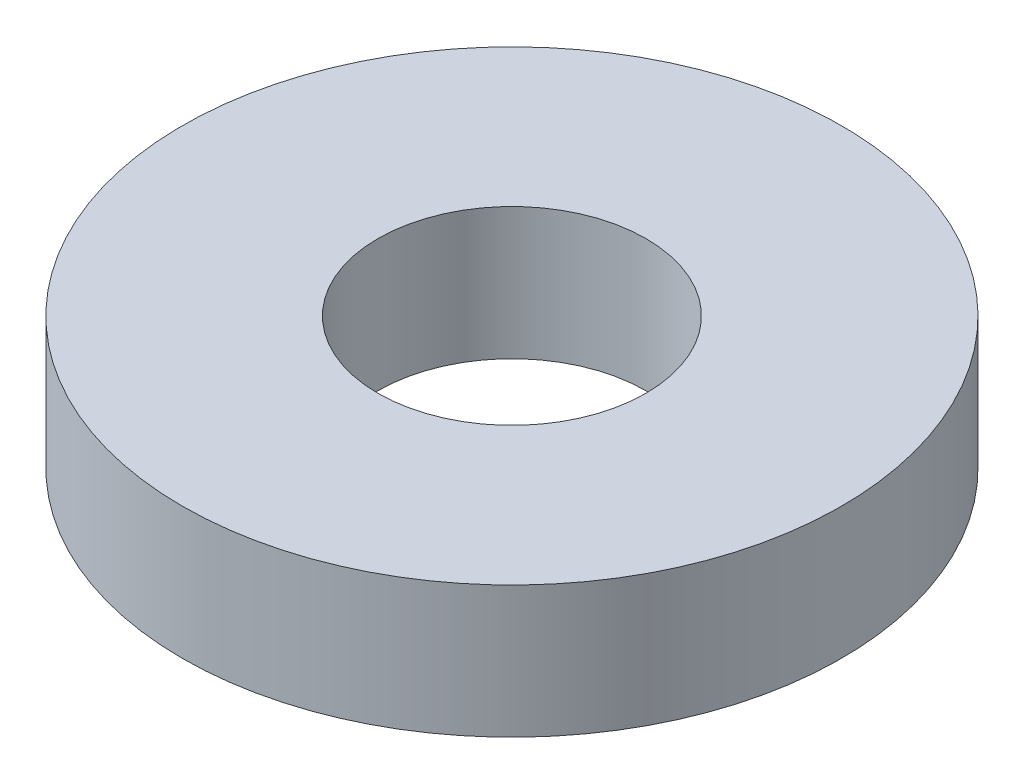
ISO-10303-21;
HEADER;
FILE_DESCRIPTION(('STEP AP214'),'2;1');
FILE_NAME('part.step','',(''),(''),'','','');
FILE_SCHEMA(('AUTOMOTIVE_DESIGN { 1 0 10303 214 1 1 1 1 }'));
ENDSEC;
DATA;
#1=APPLICATION_CONTEXT('core data for automotive mechanical design processes');
#2=APPLICATION_PROTOCOL_DEFINITION('international standard','automotive_design',2000,#1);
#3=PRODUCT_CONTEXT('',#1,'mechanical');
#4=PRODUCT('Part','Part','',(#3));
#5=PRODUCT_RELATED_PRODUCT_CATEGORY('part','',(#4));
#6=PRODUCT_DEFINITION_FORMATION('','',#4);
#7=PRODUCT_DEFINITION_CONTEXT('part definition',#1,'design');
#8=PRODUCT_DEFINITION('design','',#6,#7);
#9=PRODUCT_DEFINITION_SHAPE('','',#8);
#10=(LENGTH_UNIT() NAMED_UNIT(*) SI_UNIT(.MILLI.,.METRE.));
#11=(NAMED_UNIT(*) PLANE_ANGLE_UNIT() SI_UNIT($,.RADIAN.));
#12=(NAMED_UNIT(*) SI_UNIT($,.STERADIAN.) SOLID_ANGLE_UNIT());
#13=UNCERTAINTY_MEASURE_WITH_UNIT(LENGTH_MEASURE(1.E-05),#10,'distance_accuracy_value','');
#14=(GEOMETRIC_REPRESENTATION_CONTEXT(3) GLOBAL_UNCERTAINTY_ASSIGNED_CONTEXT((#13)) GLOBAL_UNIT_ASSIGNED_CONTEXT((#10,
#11,#12)) REPRESENTATION_CONTEXT('',''));
#15=CARTESIAN_POINT('',(0.,0.,0.));
#16=DIRECTION('',(0.,0.,1.));
#17=DIRECTION('',(1.,0.,0.));
#18=AXIS2_PLACEMENT_3D('',#15,#16,#17);
#19=CARTESIAN_POINT('',(0.,3.,0.));
#20=DIRECTION('',(0.,1.,0.));
#21=DIRECTION('',(0.,0.,1.));
#22=AXIS2_PLACEMENT_3D('',#19,#20,#21);
#23=PLANE('',#22);
#24=CARTESIAN_POINT('',(0.,3.,0.));
#25=DIRECTION('',(0.,1.,0.));
#26=DIRECTION('',(0.,0.,1.));
#27=AXIS2_PLACEMENT_3D('',#24,#25,#26);
#28=CIRCLE('',#27,7.5);
#29=CARTESIAN_POINT('',(0.,3.,7.5));
#30=VERTEX_POINT('',#29);
#31=EDGE_CURVE('E69',#30,#30,#28,.T.);
#32=ORIENTED_EDGE('',*,*,#31,.T.);
#33=EDGE_LOOP('',(#32));
#34=FACE_BOUND('',#33,.T.);
#35=CARTESIAN_POINT('',(0.,3.,0.));
#36=DIRECTION('',(0.,1.,0.));
#37=DIRECTION('',(0.,0.,1.));
#38=AXIS2_PLACEMENT_3D('',#35,#36,#37);
#39=CIRCLE('',#38,3.05);
#40=CARTESIAN_POINT('',(0.,3.,3.05));
#41=VERTEX_POINT('',#40);
#42=EDGE_CURVE('E73',#41,#41,#39,.T.);
#43=ORIENTED_EDGE('',*,*,#42,.F.);
#44=EDGE_LOOP('',(#43));
#45=FACE_BOUND('',#44,.T.);
#46=ADVANCED_FACE('F31',(#34,#45),#23,.T.);
#47=CARTESIAN_POINT('',(0.,0.,0.));
#48=DIRECTION('',(0.,1.,0.));
#49=DIRECTION('',(0.,0.,1.));
#50=AXIS2_PLACEMENT_3D('',#47,#48,#49);
#51=PLANE('',#50);
#52=CARTESIAN_POINT('',(2.96831552407694,0.,-4.08553582159352));
#53=DIRECTION('',(0.,1.,0.));
#54=DIRECTION('',(0.,0.,1.));
#55=AXIS2_PLACEMENT_3D('',#52,#53,#54);
#56=CIRCLE('',#55,0.7);
#57=CARTESIAN_POINT('',(2.96831552407694,0.,-3.38553582159352));
#58=VERTEX_POINT('',#57);
#59=EDGE_CURVE('E10',#58,#58,#56,.F.);
#60=ORIENTED_EDGE('',*,*,#59,.F.);
#61=EDGE_LOOP('',(#60));
#62=FACE_BOUND('',#61,.T.);
#63=CARTESIAN_POINT('',(4.80283540729051,0.,-1.56053582159354));
#64=DIRECTION('',(0.,1.,0.));
#65=DIRECTION('',(0.,0.,1.));
#66=AXIS2_PLACEMENT_3D('',#63,#64,#65);
#67=CIRCLE('',#66,0.7);
#68=CARTESIAN_POINT('',(4.80283540729051,0.,-0.860535821593539));
#69=VERTEX_POINT('',#68);
#70=EDGE_CURVE('E38',#69,#69,#67,.F.);
#71=ORIENTED_EDGE('',*,*,#70,.F.);
#72=EDGE_LOOP('',(#71));
#73=FACE_BOUND('',#72,.T.);
#74=CARTESIAN_POINT('',(4.80283540729054,0.,1.56053582159344));
#75=DIRECTION('',(0.,1.,0.));
#76=DIRECTION('',(0.,0.,1.));
#77=AXIS2_PLACEMENT_3D('',#74,#75,#76);
#78=CIRCLE('',#77,0.7);
#79=CARTESIAN_POINT('',(4.80283540729054,0.,2.26053582159344));
#80=VERTEX_POINT('',#79);
#81=EDGE_CURVE('E42',#80,#80,#78,.F.);
#82=ORIENTED_EDGE('',*,*,#81,.F.);
#83=EDGE_LOOP('',(#82));
#84=FACE_BOUND('',#83,.T.);
#85=CARTESIAN_POINT('',(2.96831552407703,0.,4.08553582159346));
#86=DIRECTION('',(0.,1.,0.));
#87=DIRECTION('',(0.,0.,1.));
#88=AXIS2_PLACEMENT_3D('',#85,#86,#87);
#89=CIRCLE('',#88,0.7);
#90=CARTESIAN_POINT('',(2.96831552407703,0.,4.78553582159346));
#91=VERTEX_POINT('',#90);
#92=EDGE_CURVE('E46',#91,#91,#89,.F.);
#93=ORIENTED_EDGE('',*,*,#92,.F.);
#94=EDGE_LOOP('',(#93));
#95=FACE_BOUND('',#94,.T.);
#96=CARTESIAN_POINT('',(0.,0.,5.05));
#97=DIRECTION('',(0.,1.,0.));
#98=DIRECTION('',(0.,0.,1.));
#99=AXIS2_PLACEMENT_3D('',#96,#97,#98);
#100=CIRCLE('',#99,0.7);
#101=CARTESIAN_POINT('',(0.,0.,5.75));
#102=VERTEX_POINT('',#101);
#103=EDGE_CURVE('E51',#102,#102,#100,.F.);
#104=ORIENTED_EDGE('',*,*,#103,.F.);
#105=EDGE_LOOP('',(#104));
#106=FACE_BOUND('',#105,.T.);
#107=CARTESIAN_POINT('',(-2.96831552407697,0.,4.0855358215935));
#108=DIRECTION('',(0.,1.,0.));
#109=DIRECTION('',(0.,0.,1.));
#110=AXIS2_PLACEMENT_3D('',#107,#108,#109);
#111=CIRCLE('',#110,0.7);
#112=CARTESIAN_POINT('',(-2.96831552407697,0.,4.7855358215935));
#113=VERTEX_POINT('',#112);
#114=EDGE_CURVE('E54',#113,#113,#111,.F.);
#115=ORIENTED_EDGE('',*,*,#114,.F.);
#116=EDGE_LOOP('',(#115));
#117=FACE_BOUND('',#116,.T.);
#118=CARTESIAN_POINT('',(-4.80283540729052,0.,1.56053582159351));
#119=DIRECTION('',(0.,1.,0.));
#120=DIRECTION('',(0.,0.,1.));
#121=AXIS2_PLACEMENT_3D('',#118,#119,#120);
#122=CIRCLE('',#121,0.7);
#123=CARTESIAN_POINT('',(-4.80283540729052,0.,2.26053582159351));
#124=VERTEX_POINT('',#123);
#125=EDGE_CURVE('E57',#124,#124,#122,.F.);
#126=ORIENTED_EDGE('',*,*,#125,.F.);
#127=EDGE_LOOP('',(#126));
#128=FACE_BOUND('',#127,.T.);
#129=CARTESIAN_POINT('',(-4.80283540729053,0.,-1.56053582159347));
#130=DIRECTION('',(0.,1.,0.));
#131=DIRECTION('',(0.,0.,1.));
#132=AXIS2_PLACEMENT_3D('',#129,#130,#131);
#133=CIRCLE('',#132,0.7);
#134=CARTESIAN_POINT('',(-4.80283540729053,0.,-0.860535821593471));
#135=VERTEX_POINT('',#134);
#136=EDGE_CURVE('E60',#135,#135,#133,.F.);
#137=ORIENTED_EDGE('',*,*,#136,.F.);
#138=EDGE_LOOP('',(#137));
#139=FACE_BOUND('',#138,.T.);
#140=CARTESIAN_POINT('',(-2.968315524077,0.,-4.08553582159348));
#141=DIRECTION('',(0.,1.,0.));
#142=DIRECTION('',(0.,0.,1.));
#143=AXIS2_PLACEMENT_3D('',#140,#141,#142);
#144=CIRCLE('',#143,0.7);
#145=CARTESIAN_POINT('',(-2.968315524077,0.,-3.38553582159348));
#146=VERTEX_POINT('',#145);
#147=EDGE_CURVE('E63',#146,#146,#144,.F.);
#148=ORIENTED_EDGE('',*,*,#147,.F.);
#149=EDGE_LOOP('',(#148));
#150=FACE_BOUND('',#149,.T.);
#151=CARTESIAN_POINT('',(0.,0.,-5.05));
#152=DIRECTION('',(0.,1.,0.));
#153=DIRECTION('',(0.,0.,1.));
#154=AXIS2_PLACEMENT_3D('',#151,#152,#153);
#155=CIRCLE('',#154,0.7);
#156=CARTESIAN_POINT('',(0.,0.,-4.35));
#157=VERTEX_POINT('',#156);
#158=EDGE_CURVE('E66',#157,#157,#155,.F.);
#159=ORIENTED_EDGE('',*,*,#158,.F.);
#160=EDGE_LOOP('',(#159));
#161=FACE_BOUND('',#160,.T.);
#162=CARTESIAN_POINT('',(0.,0.,0.));
#163=DIRECTION('',(0.,1.,0.));
#164=DIRECTION('',(0.,0.,1.));
#165=AXIS2_PLACEMENT_3D('',#162,#163,#164);
#166=CIRCLE('',#165,7.5);
#167=CARTESIAN_POINT('',(0.,0.,7.5));
#168=VERTEX_POINT('',#167);
#169=EDGE_CURVE('E70',#168,#168,#166,.T.);
#170=ORIENTED_EDGE('',*,*,#169,.F.);
#171=EDGE_LOOP('',(#170));
#172=FACE_BOUND('',#171,.T.);
#173=CARTESIAN_POINT('',(0.,0.,0.));
#174=DIRECTION('',(0.,1.,0.));
#175=DIRECTION('',(0.,0.,1.));
#176=AXIS2_PLACEMENT_3D('',#173,#174,#175);
#177=CIRCLE('',#176,3.05);
#178=CARTESIAN_POINT('',(0.,0.,3.05));
#179=VERTEX_POINT('',#178);
#180=EDGE_CURVE('E76',#179,#179,#177,.T.);
#181=ORIENTED_EDGE('',*,*,#180,.T.);
#182=EDGE_LOOP('',(#181));
#183=FACE_BOUND('',#182,.T.);
#184=ADVANCED_FACE('F86',(#62,#73,#84,#95,#106,#117,#128,#139,#150,#161,#172,#183),#51,.F.);
#185=CARTESIAN_POINT('',(0.,3.,0.));
#186=DIRECTION('',(0.,-1.,0.));
#187=DIRECTION('',(0.,0.,-1.));
#188=AXIS2_PLACEMENT_3D('',#185,#186,#187);
#189=CYLINDRICAL_SURFACE('',#188,7.5);
#190=ORIENTED_EDGE('',*,*,#31,.F.);
#191=EDGE_LOOP('',(#190));
#192=FACE_BOUND('',#191,.T.);
#193=ORIENTED_EDGE('',*,*,#169,.T.);
#194=EDGE_LOOP('',(#193));
#195=FACE_BOUND('',#194,.T.);
#196=ADVANCED_FACE('F33',(#192,#195),#189,.T.);
#197=CARTESIAN_POINT('',(0.,3.,0.));
#198=DIRECTION('',(0.,-1.,0.));
#199=DIRECTION('',(0.,0.,-1.));
#200=AXIS2_PLACEMENT_3D('',#197,#198,#199);
#201=CYLINDRICAL_SURFACE('',#200,3.05);
#202=ORIENTED_EDGE('',*,*,#42,.T.);
#203=EDGE_LOOP('',(#202));
#204=FACE_BOUND('',#203,.T.);
#205=ORIENTED_EDGE('',*,*,#180,.F.);
#206=EDGE_LOOP('',(#205));
#207=FACE_BOUND('',#206,.T.);
#208=ADVANCED_FACE('F82',(#204,#207),#201,.F.);
#209=CARTESIAN_POINT('',(0.,0.,-5.05));
#210=DIRECTION('',(0.,0.,-1.));
#211=DIRECTION('',(0.,-1.,0.));
#212=AXIS2_PLACEMENT_3D('',#209,#210,#211);
#213=SPHERICAL_SURFACE('',#212,0.7);
#214=CARTESIAN_POINT('',(0.,0.,-5.05));
#215=DIRECTION('',(0.,1.,0.));
#216=DIRECTION('',(0.,0.,1.));
#217=AXIS2_PLACEMENT_3D('',#214,#215,#216);
#218=SPHERICAL_SURFACE('',#217,0.7);
#219=ORIENTED_EDGE('',*,*,#158,.T.);
#220=EDGE_LOOP('',(#219));
#221=FACE_BOUND('',#220,.T.);
#222=ADVANCED_FACE('F96',(#221),#218,.T.);
#223=CARTESIAN_POINT('',(-2.968315524077,0.,-4.08553582159348));
#224=DIRECTION('',(-0.587785252292474,0.,-0.809016994374947));
#225=DIRECTION('',(0.,-1.,0.));
#226=AXIS2_PLACEMENT_3D('',#223,#224,#225);
#227=SPHERICAL_SURFACE('',#226,0.7);
#228=CARTESIAN_POINT('',(-2.968315524077,0.,-4.08553582159348));
#229=DIRECTION('',(0.,1.,0.));
#230=DIRECTION('',(0.,0.,1.));
#231=AXIS2_PLACEMENT_3D('',#228,#229,#230);
#232=SPHERICAL_SURFACE('',#231,0.7);
#233=ORIENTED_EDGE('',*,*,#147,.T.);
#234=EDGE_LOOP('',(#233));
#235=FACE_BOUND('',#234,.T.);
#236=ADVANCED_FACE('F99',(#235),#232,.T.);
#237=CARTESIAN_POINT('',(-4.80283540729053,0.,-1.56053582159347));
#238=DIRECTION('',(-0.951056516295155,0.,-0.309016994374945));
#239=DIRECTION('',(0.,-1.,0.));
#240=AXIS2_PLACEMENT_3D('',#237,#238,#239);
#241=SPHERICAL_SURFACE('',#240,0.7);
#242=CARTESIAN_POINT('',(-4.80283540729053,0.,-1.56053582159347));
#243=DIRECTION('',(0.,1.,0.));
#244=DIRECTION('',(0.,0.,1.));
#245=AXIS2_PLACEMENT_3D('',#242,#243,#244);
#246=SPHERICAL_SURFACE('',#245,0.7);
#247=ORIENTED_EDGE('',*,*,#136,.T.);
#248=EDGE_LOOP('',(#247));
#249=FACE_BOUND('',#248,.T.);
#250=ADVANCED_FACE('F103',(#249),#246,.T.);
#251=CARTESIAN_POINT('',(-4.80283540729052,0.,1.56053582159351));
#252=DIRECTION('',(-0.951056516295152,0.,0.309016994374952));
#253=DIRECTION('',(0.,-1.,0.));
#254=AXIS2_PLACEMENT_3D('',#251,#252,#253);
#255=SPHERICAL_SURFACE('',#254,0.7);
#256=CARTESIAN_POINT('',(-4.80283540729052,0.,1.56053582159351));
#257=DIRECTION('',(0.,1.,0.));
#258=DIRECTION('',(0.,0.,1.));
#259=AXIS2_PLACEMENT_3D('',#256,#257,#258);
#260=SPHERICAL_SURFACE('',#259,0.7);
#261=ORIENTED_EDGE('',*,*,#125,.T.);
#262=EDGE_LOOP('',(#261));
#263=FACE_BOUND('',#262,.T.);
#264=ADVANCED_FACE('F107',(#263),#260,.T.);
#265=CARTESIAN_POINT('',(-2.96831552407697,0.,4.0855358215935));
#266=DIRECTION('',(-0.587785252292469,0.,0.809016994374951));
#267=DIRECTION('',(0.,-1.,0.));
#268=AXIS2_PLACEMENT_3D('',#265,#266,#267);
#269=SPHERICAL_SURFACE('',#268,0.7);
#270=CARTESIAN_POINT('',(-2.96831552407697,0.,4.0855358215935));
#271=DIRECTION('',(0.,1.,0.));
#272=DIRECTION('',(0.,0.,1.));
#273=AXIS2_PLACEMENT_3D('',#270,#271,#272);
#274=SPHERICAL_SURFACE('',#273,0.7);
#275=ORIENTED_EDGE('',*,*,#114,.T.);
#276=EDGE_LOOP('',(#275));
#277=FACE_BOUND('',#276,.T.);
#278=ADVANCED_FACE('F111',(#277),#274,.T.);
#279=CARTESIAN_POINT('',(0.,0.,5.05));
#280=DIRECTION('',(0.,0.,1.));
#281=DIRECTION('',(0.,-1.,0.));
#282=AXIS2_PLACEMENT_3D('',#279,#280,#281);
#283=SPHERICAL_SURFACE('',#282,0.7);
#284=CARTESIAN_POINT('',(0.,0.,5.05));
#285=DIRECTION('',(0.,1.,0.));
#286=DIRECTION('',(0.,0.,1.));
#287=AXIS2_PLACEMENT_3D('',#284,#285,#286);
#288=SPHERICAL_SURFACE('',#287,0.7);
#289=ORIENTED_EDGE('',*,*,#103,.T.);
#290=EDGE_LOOP('',(#289));
#291=FACE_BOUND('',#290,.T.);
#292=ADVANCED_FACE('F115',(#291),#288,.T.);
#293=CARTESIAN_POINT('',(2.96831552407703,0.,4.08553582159346));
#294=DIRECTION('',(0.58778525229248,0.,0.809016994374942));
#295=DIRECTION('',(0.,-1.,0.));
#296=AXIS2_PLACEMENT_3D('',#293,#294,#295);
#297=SPHERICAL_SURFACE('',#296,0.7);
#298=CARTESIAN_POINT('',(2.96831552407703,0.,4.08553582159346));
#299=DIRECTION('',(0.,1.,0.));
#300=DIRECTION('',(0.,0.,1.));
#301=AXIS2_PLACEMENT_3D('',#298,#299,#300);
#302=SPHERICAL_SURFACE('',#301,0.7);
#303=ORIENTED_EDGE('',*,*,#92,.T.);
#304=EDGE_LOOP('',(#303));
#305=FACE_BOUND('',#304,.T.);
#306=ADVANCED_FACE('F119',(#305),#302,.T.);
#307=CARTESIAN_POINT('',(4.80283540729054,0.,1.56053582159344));
#308=DIRECTION('',(0.951056516295157,0.,0.309016994374938));
#309=DIRECTION('',(0.,-1.,0.));
#310=AXIS2_PLACEMENT_3D('',#307,#308,#309);
#311=SPHERICAL_SURFACE('',#310,0.7);
#312=CARTESIAN_POINT('',(4.80283540729054,0.,1.56053582159344));
#313=DIRECTION('',(0.,1.,0.));
#314=DIRECTION('',(0.,0.,1.));
#315=AXIS2_PLACEMENT_3D('',#312,#313,#314);
#316=SPHERICAL_SURFACE('',#315,0.7);
#317=ORIENTED_EDGE('',*,*,#81,.T.);
#318=EDGE_LOOP('',(#317));
#319=FACE_BOUND('',#318,.T.);
#320=ADVANCED_FACE('F123',(#319),#316,.T.);
#321=CARTESIAN_POINT('',(4.80283540729051,0.,-1.56053582159354));
#322=DIRECTION('',(0.95105651629515,0.,-0.309016994374958));
#323=DIRECTION('',(0.,-1.,0.));
#324=AXIS2_PLACEMENT_3D('',#321,#322,#323);
#325=SPHERICAL_SURFACE('',#324,0.7);
#326=CARTESIAN_POINT('',(4.80283540729051,0.,-1.56053582159354));
#327=DIRECTION('',(0.,1.,0.));
#328=DIRECTION('',(0.,0.,1.));
#329=AXIS2_PLACEMENT_3D('',#326,#327,#328);
#330=SPHERICAL_SURFACE('',#329,0.7);
#331=ORIENTED_EDGE('',*,*,#70,.T.);
#332=EDGE_LOOP('',(#331));
#333=FACE_BOUND('',#332,.T.);
#334=ADVANCED_FACE('F127',(#333),#330,.T.);
#335=CARTESIAN_POINT('',(2.96831552407694,0.,-4.08553582159352));
#336=DIRECTION('',(0.587785252292462,0.,-0.809016994374955));
#337=DIRECTION('',(0.,-1.,0.));
#338=AXIS2_PLACEMENT_3D('',#335,#336,#337);
#339=SPHERICAL_SURFACE('',#338,0.7);
#340=CARTESIAN_POINT('',(2.96831552407694,0.,-4.08553582159352));
#341=DIRECTION('',(0.,1.,0.));
#342=DIRECTION('',(0.,0.,1.));
#343=AXIS2_PLACEMENT_3D('',#340,#341,#342);
#344=SPHERICAL_SURFACE('',#343,0.7);
#345=ORIENTED_EDGE('',*,*,#59,.T.);
#346=EDGE_LOOP('',(#345));
#347=FACE_BOUND('',#346,.T.);
#348=ADVANCED_FACE('F131',(#347),#344,.T.);
#349=CLOSED_SHELL('',(#46,#184,#196,#208,#222,#236,#250,#264,#278,#292,#306,#320,#334,#348));
#350=MANIFOLD_SOLID_BREP('B2',#349);
#351=ADVANCED_BREP_SHAPE_REPRESENTATION('',(#18,#350),#14);
#352=SHAPE_DEFINITION_REPRESENTATION(#9,#351);
ENDSEC;
END-ISO-10303-21;
